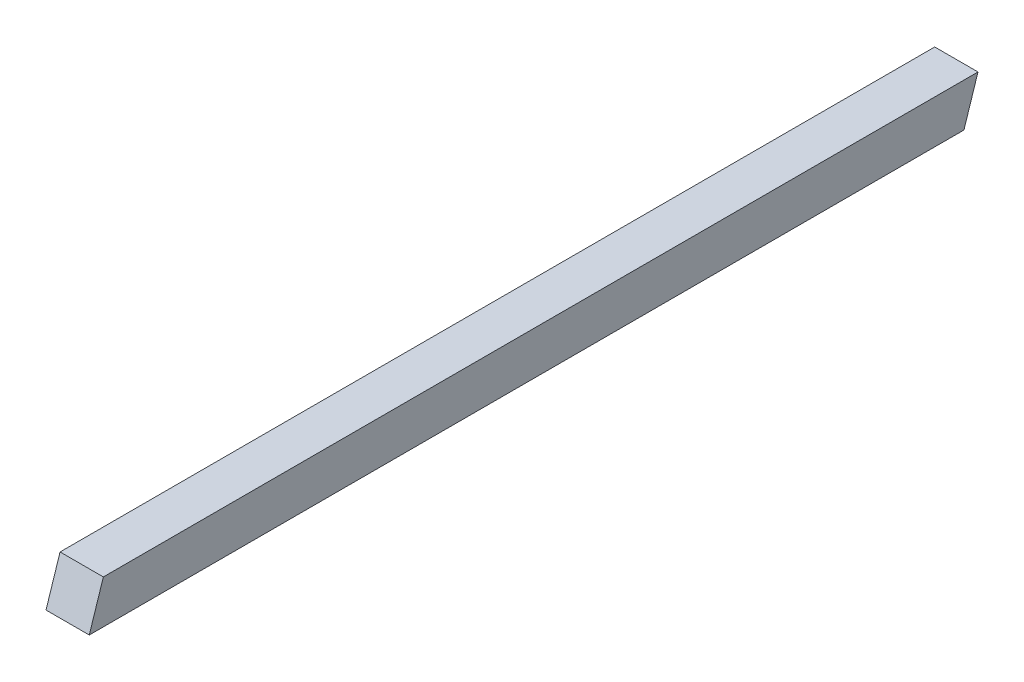
ISO-10303-21;
HEADER;
FILE_DESCRIPTION(('STEP AP214'),'2;1');
FILE_NAME('part.step','',(''),(''),'','','');
FILE_SCHEMA(('AUTOMOTIVE_DESIGN { 1 0 10303 214 1 1 1 1 }'));
ENDSEC;
DATA;
#1=APPLICATION_CONTEXT('core data for automotive mechanical design processes');
#2=APPLICATION_PROTOCOL_DEFINITION('international standard','automotive_design',2000,#1);
#3=PRODUCT_CONTEXT('',#1,'mechanical');
#4=PRODUCT('Part','Part','',(#3));
#5=PRODUCT_RELATED_PRODUCT_CATEGORY('part','',(#4));
#6=PRODUCT_DEFINITION_FORMATION('','',#4);
#7=PRODUCT_DEFINITION_CONTEXT('part definition',#1,'design');
#8=PRODUCT_DEFINITION('design','',#6,#7);
#9=PRODUCT_DEFINITION_SHAPE('','',#8);
#10=(LENGTH_UNIT() NAMED_UNIT(*) SI_UNIT(.MILLI.,.METRE.));
#11=(NAMED_UNIT(*) PLANE_ANGLE_UNIT() SI_UNIT($,.RADIAN.));
#12=(NAMED_UNIT(*) SI_UNIT($,.STERADIAN.) SOLID_ANGLE_UNIT());
#13=UNCERTAINTY_MEASURE_WITH_UNIT(LENGTH_MEASURE(1.E-05),#10,'distance_accuracy_value','');
#14=(GEOMETRIC_REPRESENTATION_CONTEXT(3) GLOBAL_UNCERTAINTY_ASSIGNED_CONTEXT((#13)) GLOBAL_UNIT_ASSIGNED_CONTEXT((#10,
#11,#12)) REPRESENTATION_CONTEXT('',''));
#15=CARTESIAN_POINT('',(0.,0.,0.));
#16=DIRECTION('',(0.,0.,1.));
#17=DIRECTION('',(1.,0.,0.));
#18=AXIS2_PLACEMENT_3D('',#15,#16,#17);
#19=CARTESIAN_POINT('',(0.,0.,0.));
#20=DIRECTION('',(0.,-1.,0.));
#21=DIRECTION('',(0.,0.,-1.));
#22=AXIS2_PLACEMENT_3D('',#19,#20,#21);
#23=PLANE('',#22);
#24=DIRECTION('',(1.,0.,0.));
#25=VECTOR('',#24,1.);
#26=CARTESIAN_POINT('',(31.75,-3.67761376907083E-13,10.3162003553928));
#27=LINE('',#26,#25);
#28=CARTESIAN_POINT('',(0.,-1.83880688453542E-13,10.3162003553934));
#29=VERTEX_POINT('',#28);
#30=CARTESIAN_POINT('',(31.75,-1.83880688453542E-13,10.3162003553934));
#31=VERTEX_POINT('',#30);
#32=EDGE_CURVE('E36',#29,#31,#27,.T.);
#33=ORIENTED_EDGE('',*,*,#32,.T.);
#34=DIRECTION('',(0.,0.,-1.));
#35=VECTOR('',#34,1.);
#36=CARTESIAN_POINT('',(31.75,0.,0.));
#37=LINE('',#36,#35);
#38=CARTESIAN_POINT('',(31.75,0.,652.018));
#39=VERTEX_POINT('',#38);
#40=EDGE_CURVE('E97',#39,#31,#37,.T.);
#41=ORIENTED_EDGE('',*,*,#40,.F.);
#42=DIRECTION('',(1.,0.,0.));
#43=VECTOR('',#42,1.);
#44=CARTESIAN_POINT('',(31.75,0.,652.018));
#45=LINE('',#44,#43);
#46=CARTESIAN_POINT('',(0.,0.,652.018));
#47=VERTEX_POINT('',#46);
#48=EDGE_CURVE('E71',#39,#47,#45,.F.);
#49=ORIENTED_EDGE('',*,*,#48,.T.);
#50=DIRECTION('',(0.,0.,1.));
#51=VECTOR('',#50,1.);
#52=CARTESIAN_POINT('',(0.,0.,0.));
#53=LINE('',#52,#51);
#54=EDGE_CURVE('E83',#29,#47,#53,.T.);
#55=ORIENTED_EDGE('',*,*,#54,.F.);
#56=EDGE_LOOP('',(#33,#41,#49,#55));
#57=FACE_BOUND('',#56,.T.);
#58=ADVANCED_FACE('F33',(#57),#23,.T.);
#59=CARTESIAN_POINT('',(31.75,31.75,0.));
#60=DIRECTION('',(0.,0.309016994374891,0.951056516295172));
#61=DIRECTION('',(0.,-0.951056516295172,0.309016994374891));
#62=AXIS2_PLACEMENT_3D('',#59,#60,#61);
#63=PLANE('',#62);
#64=DIRECTION('',(1.,0.,0.));
#65=VECTOR('',#64,1.);
#66=CARTESIAN_POINT('',(31.75,31.75,0.));
#67=LINE('',#66,#65);
#68=CARTESIAN_POINT('',(31.75,31.75,0.));
#69=VERTEX_POINT('',#68);
#70=CARTESIAN_POINT('',(0.,31.75,0.));
#71=VERTEX_POINT('',#70);
#72=EDGE_CURVE('E99',#69,#71,#67,.F.);
#73=ORIENTED_EDGE('',*,*,#72,.F.);
#74=DIRECTION('',(0.,0.951056516295161,-0.309016994374925));
#75=VECTOR('',#74,1.);
#76=CARTESIAN_POINT('',(31.75,0.,10.3162003553939));
#77=LINE('',#76,#75);
#78=EDGE_CURVE('E81',#31,#69,#77,.T.);
#79=ORIENTED_EDGE('',*,*,#78,.F.);
#80=ORIENTED_EDGE('',*,*,#32,.F.);
#81=DIRECTION('',(0.,-0.951056516295161,0.309016994374925));
#82=VECTOR('',#81,1.);
#83=CARTESIAN_POINT('',(0.,31.75,0.));
#84=LINE('',#83,#82);
#85=EDGE_CURVE('E78',#71,#29,#84,.T.);
#86=ORIENTED_EDGE('',*,*,#85,.F.);
#87=EDGE_LOOP('',(#73,#79,#80,#86));
#88=FACE_BOUND('',#87,.T.);
#89=ADVANCED_FACE('F76',(#88),#63,.F.);
#90=CARTESIAN_POINT('',(0.,31.75,0.));
#91=DIRECTION('',(-1.,0.,0.));
#92=DIRECTION('',(0.,0.,1.));
#93=AXIS2_PLACEMENT_3D('',#90,#91,#92);
#94=PLANE('',#93);
#95=DIRECTION('',(0.,0.951056516295172,-0.309016994374891));
#96=VECTOR('',#95,1.);
#97=CARTESIAN_POINT('',(0.,0.,652.018));
#98=LINE('',#97,#96);
#99=CARTESIAN_POINT('',(0.,31.749999999998,641.701799644628));
#100=VERTEX_POINT('',#99);
#101=EDGE_CURVE('E93',#47,#100,#98,.T.);
#102=ORIENTED_EDGE('',*,*,#101,.T.);
#103=DIRECTION('',(0.,0.,1.));
#104=VECTOR('',#103,1.);
#105=CARTESIAN_POINT('',(0.,31.75,0.));
#106=LINE('',#105,#104);
#107=EDGE_CURVE('E89',#71,#100,#106,.T.);
#108=ORIENTED_EDGE('',*,*,#107,.F.);
#109=ORIENTED_EDGE('',*,*,#85,.T.);
#110=ORIENTED_EDGE('',*,*,#54,.T.);
#111=EDGE_LOOP('',(#102,#108,#109,#110));
#112=FACE_BOUND('',#111,.T.);
#113=ADVANCED_FACE('F87',(#112),#94,.T.);
#114=CARTESIAN_POINT('',(31.75,0.,652.018));
#115=DIRECTION('',(0.,-0.309016994374891,-0.951056516295172));
#116=DIRECTION('',(0.,0.951056516295172,-0.309016994374891));
#117=AXIS2_PLACEMENT_3D('',#114,#115,#116);
#118=PLANE('',#117);
#119=ORIENTED_EDGE('',*,*,#48,.F.);
#120=DIRECTION('',(0.,-0.951056516295407,0.309016994374167));
#121=VECTOR('',#120,1.);
#122=CARTESIAN_POINT('',(31.75,31.75,641.701799644634));
#123=LINE('',#122,#121);
#124=CARTESIAN_POINT('',(31.75,31.7499999999961,641.701799644622));
#125=VERTEX_POINT('',#124);
#126=EDGE_CURVE('E51',#125,#39,#123,.T.);
#127=ORIENTED_EDGE('',*,*,#126,.F.);
#128=DIRECTION('',(1.,0.,0.));
#129=VECTOR('',#128,1.);
#130=CARTESIAN_POINT('',(31.75,31.75,641.701799644634));
#131=LINE('',#130,#129);
#132=EDGE_CURVE('E42',#100,#125,#131,.T.);
#133=ORIENTED_EDGE('',*,*,#132,.F.);
#134=ORIENTED_EDGE('',*,*,#101,.F.);
#135=EDGE_LOOP('',(#119,#127,#133,#134));
#136=FACE_BOUND('',#135,.T.);
#137=ADVANCED_FACE('F105',(#136),#118,.F.);
#138=CARTESIAN_POINT('',(31.75,0.,0.));
#139=DIRECTION('',(1.,0.,0.));
#140=DIRECTION('',(0.,0.,-1.));
#141=AXIS2_PLACEMENT_3D('',#138,#139,#140);
#142=PLANE('',#141);
#143=ORIENTED_EDGE('',*,*,#126,.T.);
#144=ORIENTED_EDGE('',*,*,#40,.T.);
#145=ORIENTED_EDGE('',*,*,#78,.T.);
#146=DIRECTION('',(0.,0.,1.));
#147=VECTOR('',#146,1.);
#148=CARTESIAN_POINT('',(31.75,31.75,0.));
#149=LINE('',#148,#147);
#150=EDGE_CURVE('E11',#125,#69,#149,.F.);
#151=ORIENTED_EDGE('',*,*,#150,.F.);
#152=EDGE_LOOP('',(#143,#144,#145,#151));
#153=FACE_BOUND('',#152,.T.);
#154=ADVANCED_FACE('F107',(#153),#142,.T.);
#155=CARTESIAN_POINT('',(31.75,31.75,0.));
#156=DIRECTION('',(0.,1.,0.));
#157=DIRECTION('',(0.,0.,1.));
#158=AXIS2_PLACEMENT_3D('',#155,#156,#157);
#159=PLANE('',#158);
#160=ORIENTED_EDGE('',*,*,#132,.T.);
#161=ORIENTED_EDGE('',*,*,#150,.T.);
#162=ORIENTED_EDGE('',*,*,#72,.T.);
#163=ORIENTED_EDGE('',*,*,#107,.T.);
#164=EDGE_LOOP('',(#160,#161,#162,#163));
#165=FACE_BOUND('',#164,.T.);
#166=ADVANCED_FACE('F104',(#165),#159,.T.);
#167=CLOSED_SHELL('',(#58,#89,#113,#137,#154,#166));
#168=MANIFOLD_SOLID_BREP('B2',#167);
#169=ADVANCED_BREP_SHAPE_REPRESENTATION('',(#18,#168),#14);
#170=SHAPE_DEFINITION_REPRESENTATION(#9,#169);
ENDSEC;
END-ISO-10303-21;
